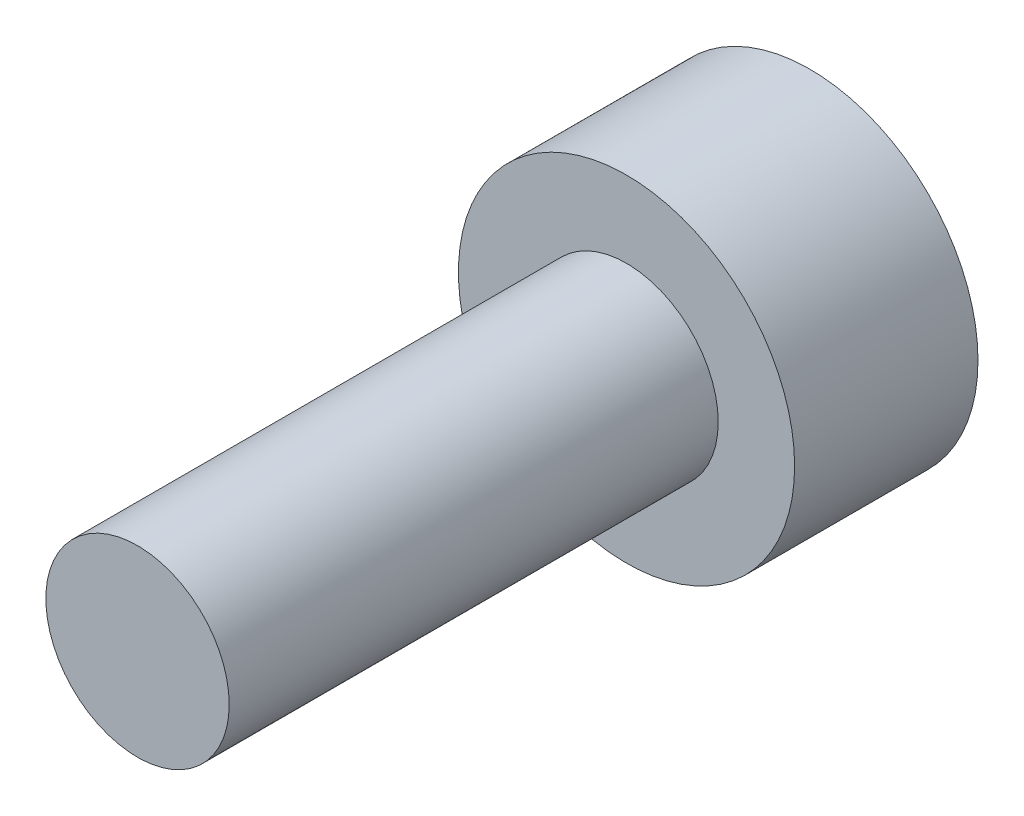
ISO-10303-21;
HEADER;
FILE_DESCRIPTION(('STEP AP214'),'2;1');
FILE_NAME('part.step','',(''),(''),'','','');
FILE_SCHEMA(('AUTOMOTIVE_DESIGN { 1 0 10303 214 1 1 1 1 }'));
ENDSEC;
DATA;
#1=APPLICATION_CONTEXT('core data for automotive mechanical design processes');
#2=APPLICATION_PROTOCOL_DEFINITION('international standard','automotive_design',2000,#1);
#3=PRODUCT_CONTEXT('',#1,'mechanical');
#4=PRODUCT('Part','Part','',(#3));
#5=PRODUCT_RELATED_PRODUCT_CATEGORY('part','',(#4));
#6=PRODUCT_DEFINITION_FORMATION('','',#4);
#7=PRODUCT_DEFINITION_CONTEXT('part definition',#1,'design');
#8=PRODUCT_DEFINITION('design','',#6,#7);
#9=PRODUCT_DEFINITION_SHAPE('','',#8);
#10=(LENGTH_UNIT() NAMED_UNIT(*) SI_UNIT(.MILLI.,.METRE.));
#11=(NAMED_UNIT(*) PLANE_ANGLE_UNIT() SI_UNIT($,.RADIAN.));
#12=(NAMED_UNIT(*) SI_UNIT($,.STERADIAN.) SOLID_ANGLE_UNIT());
#13=UNCERTAINTY_MEASURE_WITH_UNIT(LENGTH_MEASURE(1.E-05),#10,'distance_accuracy_value','');
#14=(GEOMETRIC_REPRESENTATION_CONTEXT(3) GLOBAL_UNCERTAINTY_ASSIGNED_CONTEXT((#13)) GLOBAL_UNIT_ASSIGNED_CONTEXT((#10,
#11,#12)) REPRESENTATION_CONTEXT('',''));
#15=CARTESIAN_POINT('',(0.,0.,0.));
#16=DIRECTION('',(0.,0.,1.));
#17=DIRECTION('',(1.,0.,0.));
#18=AXIS2_PLACEMENT_3D('',#15,#16,#17);
#19=CARTESIAN_POINT('',(0.,0.,-3.));
#20=DIRECTION('',(0.,0.,1.));
#21=DIRECTION('',(1.,0.,0.));
#22=AXIS2_PLACEMENT_3D('',#19,#20,#21);
#23=PLANE('',#22);
#24=CARTESIAN_POINT('',(0.,0.,-3.));
#25=DIRECTION('',(0.,0.,1.));
#26=DIRECTION('',(1.,0.,0.));
#27=AXIS2_PLACEMENT_3D('',#24,#25,#26);
#28=CIRCLE('',#27,2.75);
#29=CARTESIAN_POINT('',(2.75,0.,-3.));
#30=VERTEX_POINT('',#29);
#31=EDGE_CURVE('E111',#30,#30,#28,.T.);
#32=ORIENTED_EDGE('',*,*,#31,.F.);
#33=EDGE_LOOP('',(#32));
#34=FACE_BOUND('',#33,.T.);
#35=DIRECTION('',(-0.5,-0.866025403784439,0.));
#36=VECTOR('',#35,1.);
#37=CARTESIAN_POINT('',(1.08253175473055,-0.625,-3.));
#38=LINE('',#37,#36);
#39=CARTESIAN_POINT('',(1.44337567297406,0.,-3.));
#40=VERTEX_POINT('',#39);
#41=CARTESIAN_POINT('',(0.721687836487032,-1.25,-3.));
#42=VERTEX_POINT('',#41);
#43=EDGE_CURVE('E11',#40,#42,#38,.T.);
#44=ORIENTED_EDGE('',*,*,#43,.F.);
#45=DIRECTION('',(0.5,-0.866025403784439,0.));
#46=VECTOR('',#45,1.);
#47=CARTESIAN_POINT('',(1.08253175473055,0.625,-3.));
#48=LINE('',#47,#46);
#49=CARTESIAN_POINT('',(0.721687836487032,1.25,-3.));
#50=VERTEX_POINT('',#49);
#51=EDGE_CURVE('E50',#50,#40,#48,.T.);
#52=ORIENTED_EDGE('',*,*,#51,.F.);
#53=DIRECTION('',(1.,0.,0.));
#54=VECTOR('',#53,1.);
#55=CARTESIAN_POINT('',(0.,1.25,-3.));
#56=LINE('',#55,#54);
#57=CARTESIAN_POINT('',(-0.721687836487032,1.25,-3.));
#58=VERTEX_POINT('',#57);
#59=EDGE_CURVE('E132',#58,#50,#56,.T.);
#60=ORIENTED_EDGE('',*,*,#59,.F.);
#61=DIRECTION('',(0.5,0.866025403784439,0.));
#62=VECTOR('',#61,1.);
#63=CARTESIAN_POINT('',(-1.08253175473055,0.625,-3.));
#64=LINE('',#63,#62);
#65=CARTESIAN_POINT('',(-1.44337567297406,0.,-3.));
#66=VERTEX_POINT('',#65);
#67=EDGE_CURVE('E126',#66,#58,#64,.T.);
#68=ORIENTED_EDGE('',*,*,#67,.F.);
#69=DIRECTION('',(-0.5,0.866025403784439,0.));
#70=VECTOR('',#69,1.);
#71=CARTESIAN_POINT('',(-1.08253175473055,-0.624999999999999,-3.));
#72=LINE('',#71,#70);
#73=CARTESIAN_POINT('',(-0.721687836487033,-1.25,-3.));
#74=VERTEX_POINT('',#73);
#75=EDGE_CURVE('E130',#74,#66,#72,.T.);
#76=ORIENTED_EDGE('',*,*,#75,.F.);
#77=DIRECTION('',(-1.,0.,0.));
#78=VECTOR('',#77,1.);
#79=CARTESIAN_POINT('',(0.,-1.25,-3.));
#80=LINE('',#79,#78);
#81=EDGE_CURVE('E119',#42,#74,#80,.T.);
#82=ORIENTED_EDGE('',*,*,#81,.F.);
#83=EDGE_LOOP('',(#44,#52,#60,#68,#76,#82));
#84=FACE_BOUND('',#83,.T.);
#85=ADVANCED_FACE('F39',(#34,#84),#23,.F.);
#86=CARTESIAN_POINT('',(0.,0.,0.));
#87=DIRECTION('',(0.,0.,-1.));
#88=DIRECTION('',(-1.,0.,0.));
#89=AXIS2_PLACEMENT_3D('',#86,#87,#88);
#90=CYLINDRICAL_SURFACE('',#89,2.75);
#91=CARTESIAN_POINT('',(0.,0.,0.));
#92=DIRECTION('',(0.,0.,1.));
#93=DIRECTION('',(1.,0.,0.));
#94=AXIS2_PLACEMENT_3D('',#91,#92,#93);
#95=CIRCLE('',#94,2.75);
#96=CARTESIAN_POINT('',(2.75,0.,0.));
#97=VERTEX_POINT('',#96);
#98=EDGE_CURVE('E122',#97,#97,#95,.T.);
#99=ORIENTED_EDGE('',*,*,#98,.F.);
#100=EDGE_LOOP('',(#99));
#101=FACE_BOUND('',#100,.T.);
#102=ORIENTED_EDGE('',*,*,#31,.T.);
#103=EDGE_LOOP('',(#102));
#104=FACE_BOUND('',#103,.T.);
#105=ADVANCED_FACE('F41',(#101,#104),#90,.T.);
#106=CARTESIAN_POINT('',(0.,0.,0.));
#107=DIRECTION('',(0.,0.,1.));
#108=DIRECTION('',(1.,0.,0.));
#109=AXIS2_PLACEMENT_3D('',#106,#107,#108);
#110=PLANE('',#109);
#111=CARTESIAN_POINT('',(0.,0.,0.));
#112=DIRECTION('',(0.,0.,1.));
#113=DIRECTION('',(1.,0.,0.));
#114=AXIS2_PLACEMENT_3D('',#111,#112,#113);
#115=CIRCLE('',#114,1.5);
#116=CARTESIAN_POINT('',(1.5,0.,0.));
#117=VERTEX_POINT('',#116);
#118=EDGE_CURVE('E120',#117,#117,#115,.T.);
#119=ORIENTED_EDGE('',*,*,#118,.F.);
#120=EDGE_LOOP('',(#119));
#121=FACE_BOUND('',#120,.T.);
#122=ORIENTED_EDGE('',*,*,#98,.T.);
#123=EDGE_LOOP('',(#122));
#124=FACE_BOUND('',#123,.T.);
#125=ADVANCED_FACE('F178',(#121,#124),#110,.T.);
#126=CARTESIAN_POINT('',(0.,0.,8.));
#127=DIRECTION('',(0.,0.,-1.));
#128=DIRECTION('',(-1.,0.,0.));
#129=AXIS2_PLACEMENT_3D('',#126,#127,#128);
#130=CYLINDRICAL_SURFACE('',#129,1.5);
#131=CARTESIAN_POINT('',(0.,0.,8.));
#132=DIRECTION('',(0.,0.,1.));
#133=DIRECTION('',(1.,0.,0.));
#134=AXIS2_PLACEMENT_3D('',#131,#132,#133);
#135=CIRCLE('',#134,1.5);
#136=CARTESIAN_POINT('',(1.5,0.,8.));
#137=VERTEX_POINT('',#136);
#138=EDGE_CURVE('E110',#137,#137,#135,.T.);
#139=ORIENTED_EDGE('',*,*,#138,.F.);
#140=EDGE_LOOP('',(#139));
#141=FACE_BOUND('',#140,.T.);
#142=ORIENTED_EDGE('',*,*,#118,.T.);
#143=EDGE_LOOP('',(#142));
#144=FACE_BOUND('',#143,.T.);
#145=ADVANCED_FACE('F183',(#141,#144),#130,.T.);
#146=CARTESIAN_POINT('',(0.,0.,8.));
#147=DIRECTION('',(0.,0.,1.));
#148=DIRECTION('',(1.,0.,0.));
#149=AXIS2_PLACEMENT_3D('',#146,#147,#148);
#150=PLANE('',#149);
#151=ORIENTED_EDGE('',*,*,#138,.T.);
#152=EDGE_LOOP('',(#151));
#153=FACE_BOUND('',#152,.T.);
#154=ADVANCED_FACE('F189',(#153),#150,.T.);
#155=CARTESIAN_POINT('',(0.721687836487032,-1.25,-1.35));
#156=DIRECTION('',(-0.866025403784439,0.5,0.));
#157=DIRECTION('',(-0.5,-0.866025403784439,0.));
#158=AXIS2_PLACEMENT_3D('',#155,#156,#157);
#159=PLANE('',#158);
#160=ORIENTED_EDGE('',*,*,#43,.T.);
#161=DIRECTION('',(0.,0.,-1.));
#162=VECTOR('',#161,1.);
#163=CARTESIAN_POINT('',(0.721687836487032,-1.25,-1.35));
#164=LINE('',#163,#162);
#165=CARTESIAN_POINT('',(0.721687836487032,-1.25,-1.35));
#166=VERTEX_POINT('',#165);
#167=EDGE_CURVE('E53',#166,#42,#164,.T.);
#168=ORIENTED_EDGE('',*,*,#167,.F.);
#169=DIRECTION('',(0.5,0.866025403784439,0.));
#170=VECTOR('',#169,1.);
#171=CARTESIAN_POINT('',(0.721687836487032,-1.25,-1.35));
#172=LINE('',#171,#170);
#173=CARTESIAN_POINT('',(1.44337567297406,0.,-1.35));
#174=VERTEX_POINT('',#173);
#175=EDGE_CURVE('E98',#166,#174,#172,.T.);
#176=ORIENTED_EDGE('',*,*,#175,.T.);
#177=DIRECTION('',(0.,0.,-1.));
#178=VECTOR('',#177,1.);
#179=CARTESIAN_POINT('',(1.44337567297406,0.,-1.35));
#180=LINE('',#179,#178);
#181=EDGE_CURVE('E101',#174,#40,#180,.T.);
#182=ORIENTED_EDGE('',*,*,#181,.T.);
#183=EDGE_LOOP('',(#160,#168,#176,#182));
#184=FACE_BOUND('',#183,.T.);
#185=ADVANCED_FACE('F105',(#184),#159,.T.);
#186=CARTESIAN_POINT('',(1.44337567297406,0.,-1.35));
#187=DIRECTION('',(-0.866025403784439,-0.5,0.));
#188=DIRECTION('',(0.5,-0.866025403784439,0.));
#189=AXIS2_PLACEMENT_3D('',#186,#187,#188);
#190=PLANE('',#189);
#191=ORIENTED_EDGE('',*,*,#51,.T.);
#192=ORIENTED_EDGE('',*,*,#181,.F.);
#193=DIRECTION('',(-0.5,0.866025403784439,0.));
#194=VECTOR('',#193,1.);
#195=CARTESIAN_POINT('',(1.44337567297406,0.,-1.35));
#196=LINE('',#195,#194);
#197=CARTESIAN_POINT('',(0.721687836487032,1.25,-1.35));
#198=VERTEX_POINT('',#197);
#199=EDGE_CURVE('E92',#174,#198,#196,.T.);
#200=ORIENTED_EDGE('',*,*,#199,.T.);
#201=DIRECTION('',(0.,0.,-1.));
#202=VECTOR('',#201,1.);
#203=CARTESIAN_POINT('',(0.721687836487032,1.25,-1.35));
#204=LINE('',#203,#202);
#205=EDGE_CURVE('E108',#198,#50,#204,.T.);
#206=ORIENTED_EDGE('',*,*,#205,.T.);
#207=EDGE_LOOP('',(#191,#192,#200,#206));
#208=FACE_BOUND('',#207,.T.);
#209=ADVANCED_FACE('F106',(#208),#190,.T.);
#210=CARTESIAN_POINT('',(0.721687836487032,1.25,-1.35));
#211=DIRECTION('',(0.,-1.,0.));
#212=DIRECTION('',(1.,0.,0.));
#213=AXIS2_PLACEMENT_3D('',#210,#211,#212);
#214=PLANE('',#213);
#215=ORIENTED_EDGE('',*,*,#59,.T.);
#216=ORIENTED_EDGE('',*,*,#205,.F.);
#217=DIRECTION('',(-1.,0.,0.));
#218=VECTOR('',#217,1.);
#219=CARTESIAN_POINT('',(0.721687836487032,1.25,-1.35));
#220=LINE('',#219,#218);
#221=CARTESIAN_POINT('',(-0.721687836487032,1.25,-1.35));
#222=VERTEX_POINT('',#221);
#223=EDGE_CURVE('E96',#198,#222,#220,.T.);
#224=ORIENTED_EDGE('',*,*,#223,.T.);
#225=DIRECTION('',(0.,0.,-1.));
#226=VECTOR('',#225,1.);
#227=CARTESIAN_POINT('',(-0.721687836487032,1.25,-1.35));
#228=LINE('',#227,#226);
#229=EDGE_CURVE('E113',#222,#58,#228,.T.);
#230=ORIENTED_EDGE('',*,*,#229,.T.);
#231=EDGE_LOOP('',(#215,#216,#224,#230));
#232=FACE_BOUND('',#231,.T.);
#233=ADVANCED_FACE('F133',(#232),#214,.T.);
#234=CARTESIAN_POINT('',(-0.721687836487032,1.25,-1.35));
#235=DIRECTION('',(0.866025403784439,-0.5,0.));
#236=DIRECTION('',(0.5,0.866025403784439,0.));
#237=AXIS2_PLACEMENT_3D('',#234,#235,#236);
#238=PLANE('',#237);
#239=ORIENTED_EDGE('',*,*,#67,.T.);
#240=ORIENTED_EDGE('',*,*,#229,.F.);
#241=DIRECTION('',(-0.5,-0.866025403784439,0.));
#242=VECTOR('',#241,1.);
#243=CARTESIAN_POINT('',(-0.721687836487032,1.25,-1.35));
#244=LINE('',#243,#242);
#245=CARTESIAN_POINT('',(-1.44337567297406,0.,-1.35));
#246=VERTEX_POINT('',#245);
#247=EDGE_CURVE('E158',#222,#246,#244,.T.);
#248=ORIENTED_EDGE('',*,*,#247,.T.);
#249=DIRECTION('',(0.,0.,-1.));
#250=VECTOR('',#249,1.);
#251=CARTESIAN_POINT('',(-1.44337567297406,0.,-1.35));
#252=LINE('',#251,#250);
#253=EDGE_CURVE('E152',#246,#66,#252,.T.);
#254=ORIENTED_EDGE('',*,*,#253,.T.);
#255=EDGE_LOOP('',(#239,#240,#248,#254));
#256=FACE_BOUND('',#255,.T.);
#257=ADVANCED_FACE('F162',(#256),#238,.T.);
#258=CARTESIAN_POINT('',(-1.44337567297406,0.,-1.35));
#259=DIRECTION('',(0.866025403784439,0.5,0.));
#260=DIRECTION('',(-0.5,0.866025403784439,0.));
#261=AXIS2_PLACEMENT_3D('',#258,#259,#260);
#262=PLANE('',#261);
#263=ORIENTED_EDGE('',*,*,#75,.T.);
#264=ORIENTED_EDGE('',*,*,#253,.F.);
#265=DIRECTION('',(0.5,-0.866025403784439,0.));
#266=VECTOR('',#265,1.);
#267=CARTESIAN_POINT('',(-1.44337567297406,0.,-1.35));
#268=LINE('',#267,#266);
#269=CARTESIAN_POINT('',(-0.721687836487033,-1.25,-1.35));
#270=VERTEX_POINT('',#269);
#271=EDGE_CURVE('E148',#246,#270,#268,.T.);
#272=ORIENTED_EDGE('',*,*,#271,.T.);
#273=DIRECTION('',(0.,0.,-1.));
#274=VECTOR('',#273,1.);
#275=CARTESIAN_POINT('',(-0.721687836487033,-1.25,-1.35));
#276=LINE('',#275,#274);
#277=EDGE_CURVE('E144',#270,#74,#276,.T.);
#278=ORIENTED_EDGE('',*,*,#277,.T.);
#279=EDGE_LOOP('',(#263,#264,#272,#278));
#280=FACE_BOUND('',#279,.T.);
#281=ADVANCED_FACE('F147',(#280),#262,.T.);
#282=CARTESIAN_POINT('',(-0.721687836487033,-1.25,-1.35));
#283=DIRECTION('',(0.,1.,0.));
#284=DIRECTION('',(-1.,0.,0.));
#285=AXIS2_PLACEMENT_3D('',#282,#283,#284);
#286=PLANE('',#285);
#287=ORIENTED_EDGE('',*,*,#81,.T.);
#288=ORIENTED_EDGE('',*,*,#277,.F.);
#289=DIRECTION('',(1.,0.,0.));
#290=VECTOR('',#289,1.);
#291=CARTESIAN_POINT('',(-0.721687836487033,-1.25,-1.35));
#292=LINE('',#291,#290);
#293=EDGE_CURVE('E151',#270,#166,#292,.T.);
#294=ORIENTED_EDGE('',*,*,#293,.T.);
#295=ORIENTED_EDGE('',*,*,#167,.T.);
#296=EDGE_LOOP('',(#287,#288,#294,#295));
#297=FACE_BOUND('',#296,.T.);
#298=ADVANCED_FACE('F141',(#297),#286,.T.);
#299=CARTESIAN_POINT('',(0.,0.,-1.35));
#300=DIRECTION('',(0.,0.,1.));
#301=DIRECTION('',(1.,0.,0.));
#302=AXIS2_PLACEMENT_3D('',#299,#300,#301);
#303=PLANE('',#302);
#304=ORIENTED_EDGE('',*,*,#175,.F.);
#305=ORIENTED_EDGE('',*,*,#293,.F.);
#306=ORIENTED_EDGE('',*,*,#271,.F.);
#307=ORIENTED_EDGE('',*,*,#247,.F.);
#308=ORIENTED_EDGE('',*,*,#223,.F.);
#309=ORIENTED_EDGE('',*,*,#199,.F.);
#310=EDGE_LOOP('',(#304,#305,#306,#307,#308,#309));
#311=FACE_BOUND('',#310,.T.);
#312=ADVANCED_FACE('F93',(#311),#303,.F.);
#313=CLOSED_SHELL('',(#85,#105,#125,#145,#154,#185,#209,#233,#257,#281,#298,#312));
#314=MANIFOLD_SOLID_BREP('B2',#313);
#315=ADVANCED_BREP_SHAPE_REPRESENTATION('',(#18,#314),#14);
#316=SHAPE_DEFINITION_REPRESENTATION(#9,#315);
ENDSEC;
END-ISO-10303-21;
